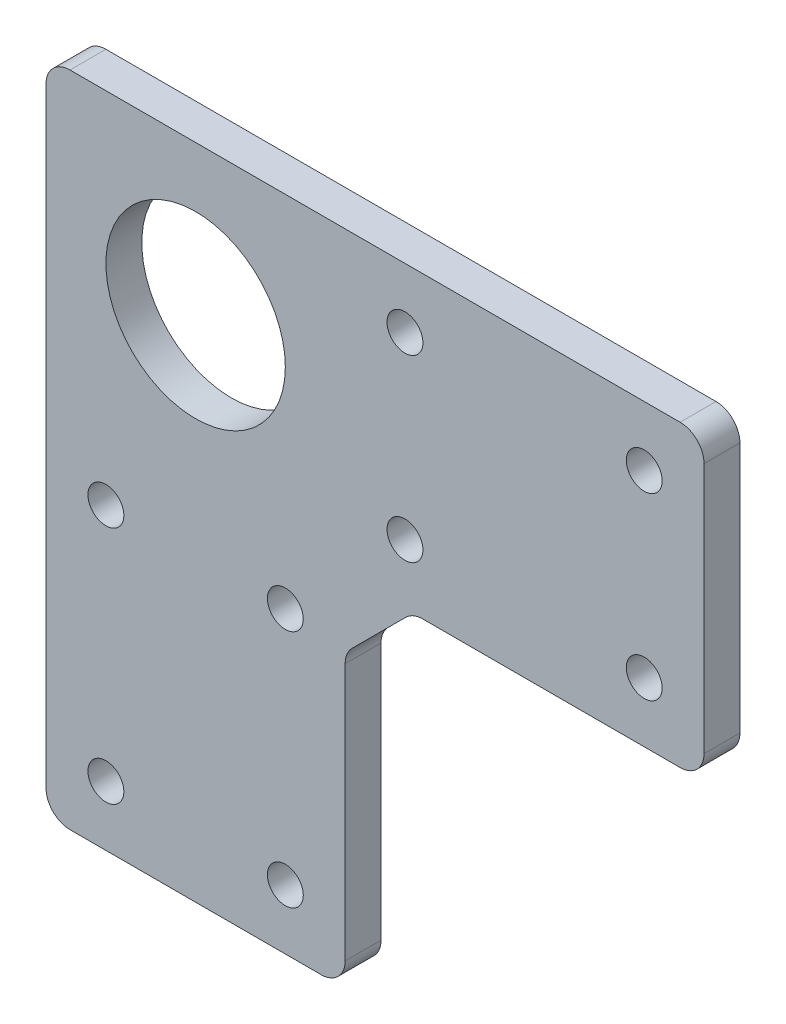
ISO-10303-21;
HEADER;
FILE_DESCRIPTION(('STEP AP214'),'2;1');
FILE_NAME('part.step','',(''),(''),'','','');
FILE_SCHEMA(('AUTOMOTIVE_DESIGN { 1 0 10303 214 1 1 1 1 }'));
ENDSEC;
DATA;
#1=APPLICATION_CONTEXT('core data for automotive mechanical design processes');
#2=APPLICATION_PROTOCOL_DEFINITION('international standard','automotive_design',2000,#1);
#3=PRODUCT_CONTEXT('',#1,'mechanical');
#4=PRODUCT('Part','Part','',(#3));
#5=PRODUCT_RELATED_PRODUCT_CATEGORY('part','',(#4));
#6=PRODUCT_DEFINITION_FORMATION('','',#4);
#7=PRODUCT_DEFINITION_CONTEXT('part definition',#1,'design');
#8=PRODUCT_DEFINITION('design','',#6,#7);
#9=PRODUCT_DEFINITION_SHAPE('','',#8);
#10=(LENGTH_UNIT() NAMED_UNIT(*) SI_UNIT(.MILLI.,.METRE.));
#11=(NAMED_UNIT(*) PLANE_ANGLE_UNIT() SI_UNIT($,.RADIAN.));
#12=(NAMED_UNIT(*) SI_UNIT($,.STERADIAN.) SOLID_ANGLE_UNIT());
#13=UNCERTAINTY_MEASURE_WITH_UNIT(LENGTH_MEASURE(1.E-05),#10,'distance_accuracy_value','');
#14=(GEOMETRIC_REPRESENTATION_CONTEXT(3) GLOBAL_UNCERTAINTY_ASSIGNED_CONTEXT((#13)) GLOBAL_UNIT_ASSIGNED_CONTEXT((#10,
#11,#12)) REPRESENTATION_CONTEXT('',''));
#15=CARTESIAN_POINT('',(0.,0.,0.));
#16=DIRECTION('',(0.,0.,1.));
#17=DIRECTION('',(1.,0.,0.));
#18=AXIS2_PLACEMENT_3D('',#15,#16,#17);
#19=CARTESIAN_POINT('',(25.,0.,1.5));
#20=DIRECTION('',(1.,0.,0.));
#21=DIRECTION('',(0.,1.,0.));
#22=AXIS2_PLACEMENT_3D('',#19,#20,#21);
#23=PLANE('',#22);
#24=DIRECTION('',(0.,-1.,0.));
#25=VECTOR('',#24,1.);
#26=CARTESIAN_POINT('',(25.,0.,1.5));
#27=LINE('',#26,#25);
#28=CARTESIAN_POINT('',(25.,-6.48528137423857,1.5));
#29=VERTEX_POINT('',#28);
#30=CARTESIAN_POINT('',(25.,-28.,1.5));
#31=VERTEX_POINT('',#30);
#32=EDGE_CURVE('E155',#29,#31,#27,.T.);
#33=ORIENTED_EDGE('',*,*,#32,.T.);
#34=DIRECTION('',(0.,0.,-1.));
#35=VECTOR('',#34,1.);
#36=CARTESIAN_POINT('',(25.,-28.,-1.5));
#37=LINE('',#36,#35);
#38=CARTESIAN_POINT('',(25.,-28.,-1.5));
#39=VERTEX_POINT('',#38);
#40=EDGE_CURVE('E159',#31,#39,#37,.T.);
#41=ORIENTED_EDGE('',*,*,#40,.T.);
#42=DIRECTION('',(0.,-1.,0.));
#43=VECTOR('',#42,1.);
#44=CARTESIAN_POINT('',(25.,0.,-1.5));
#45=LINE('',#44,#43);
#46=CARTESIAN_POINT('',(25.,-6.48528137423857,-1.5));
#47=VERTEX_POINT('',#46);
#48=EDGE_CURVE('E158',#47,#39,#45,.T.);
#49=ORIENTED_EDGE('',*,*,#48,.F.);
#50=DIRECTION('',(0.,0.,1.));
#51=VECTOR('',#50,1.);
#52=CARTESIAN_POINT('',(25.,-6.48528137423857,1.5));
#53=LINE('',#52,#51);
#54=EDGE_CURVE('E144',#47,#29,#53,.T.);
#55=ORIENTED_EDGE('',*,*,#54,.T.);
#56=EDGE_LOOP('',(#33,#41,#49,#55));
#57=FACE_BOUND('',#56,.T.);
#58=ADVANCED_FACE('F37',(#57),#23,.T.);
#59=CARTESIAN_POINT('',(0.,0.,1.5));
#60=DIRECTION('',(0.,1.,0.));
#61=DIRECTION('',(0.,0.,1.));
#62=AXIS2_PLACEMENT_3D('',#59,#60,#61);
#63=PLANE('',#62);
#64=DIRECTION('',(1.,0.,0.));
#65=VECTOR('',#64,1.);
#66=CARTESIAN_POINT('',(0.,0.,-1.5));
#67=LINE('',#66,#65);
#68=CARTESIAN_POINT('',(31.4852813742386,0.,-1.5));
#69=VERTEX_POINT('',#68);
#70=CARTESIAN_POINT('',(53.,0.,-1.5));
#71=VERTEX_POINT('',#70);
#72=EDGE_CURVE('E189',#69,#71,#67,.T.);
#73=ORIENTED_EDGE('',*,*,#72,.T.);
#74=DIRECTION('',(0.,0.,-1.));
#75=VECTOR('',#74,1.);
#76=CARTESIAN_POINT('',(53.,0.,1.5));
#77=LINE('',#76,#75);
#78=CARTESIAN_POINT('',(53.,0.,1.5));
#79=VERTEX_POINT('',#78);
#80=EDGE_CURVE('E271',#71,#79,#77,.F.);
#81=ORIENTED_EDGE('',*,*,#80,.T.);
#82=DIRECTION('',(1.,0.,0.));
#83=VECTOR('',#82,1.);
#84=CARTESIAN_POINT('',(0.,0.,1.5));
#85=LINE('',#84,#83);
#86=CARTESIAN_POINT('',(31.4852813742386,0.,1.5));
#87=VERTEX_POINT('',#86);
#88=EDGE_CURVE('E167',#87,#79,#85,.T.);
#89=ORIENTED_EDGE('',*,*,#88,.F.);
#90=DIRECTION('',(0.,0.,1.));
#91=VECTOR('',#90,1.);
#92=CARTESIAN_POINT('',(31.4852813742386,0.,1.5));
#93=LINE('',#92,#91);
#94=EDGE_CURVE('E269',#87,#69,#93,.F.);
#95=ORIENTED_EDGE('',*,*,#94,.T.);
#96=EDGE_LOOP('',(#73,#81,#89,#95));
#97=FACE_BOUND('',#96,.T.);
#98=ADVANCED_FACE('F285',(#97),#63,.F.);
#99=CARTESIAN_POINT('',(55.,0.,1.5));
#100=DIRECTION('',(-1.,0.,0.));
#101=DIRECTION('',(0.,-1.,0.));
#102=AXIS2_PLACEMENT_3D('',#99,#100,#101);
#103=PLANE('',#102);
#104=DIRECTION('',(0.,1.,0.));
#105=VECTOR('',#104,1.);
#106=CARTESIAN_POINT('',(55.,0.,-1.5));
#107=LINE('',#106,#105);
#108=CARTESIAN_POINT('',(55.,2.,-1.5));
#109=VERTEX_POINT('',#108);
#110=CARTESIAN_POINT('',(55.,23.,-1.5));
#111=VERTEX_POINT('',#110);
#112=EDGE_CURVE('E192',#109,#111,#107,.T.);
#113=ORIENTED_EDGE('',*,*,#112,.T.);
#114=DIRECTION('',(0.,0.,-1.));
#115=VECTOR('',#114,1.);
#116=CARTESIAN_POINT('',(55.,23.,1.5));
#117=LINE('',#116,#115);
#118=CARTESIAN_POINT('',(55.,23.,1.5));
#119=VERTEX_POINT('',#118);
#120=EDGE_CURVE('E267',#111,#119,#117,.F.);
#121=ORIENTED_EDGE('',*,*,#120,.T.);
#122=DIRECTION('',(0.,1.,0.));
#123=VECTOR('',#122,1.);
#124=CARTESIAN_POINT('',(55.,0.,1.5));
#125=LINE('',#124,#123);
#126=CARTESIAN_POINT('',(55.,2.,1.5));
#127=VERTEX_POINT('',#126);
#128=EDGE_CURVE('E171',#127,#119,#125,.T.);
#129=ORIENTED_EDGE('',*,*,#128,.F.);
#130=DIRECTION('',(0.,0.,-1.));
#131=VECTOR('',#130,1.);
#132=CARTESIAN_POINT('',(55.,2.,1.5));
#133=LINE('',#132,#131);
#134=EDGE_CURVE('E264',#127,#109,#133,.T.);
#135=ORIENTED_EDGE('',*,*,#134,.T.);
#136=EDGE_LOOP('',(#113,#121,#129,#135));
#137=FACE_BOUND('',#136,.T.);
#138=ADVANCED_FACE('F353',(#137),#103,.F.);
#139=CARTESIAN_POINT('',(0.,25.,1.5));
#140=DIRECTION('',(0.,1.,0.));
#141=DIRECTION('',(0.,0.,1.));
#142=AXIS2_PLACEMENT_3D('',#139,#140,#141);
#143=PLANE('',#142);
#144=DIRECTION('',(1.,0.,0.));
#145=VECTOR('',#144,1.);
#146=CARTESIAN_POINT('',(0.,25.,-1.5));
#147=LINE('',#146,#145);
#148=CARTESIAN_POINT('',(2.,25.,-1.5));
#149=VERTEX_POINT('',#148);
#150=CARTESIAN_POINT('',(53.,25.,-1.5));
#151=VERTEX_POINT('',#150);
#152=EDGE_CURVE('E195',#149,#151,#147,.T.);
#153=ORIENTED_EDGE('',*,*,#152,.F.);
#154=DIRECTION('',(0.,0.,-1.));
#155=VECTOR('',#154,1.);
#156=CARTESIAN_POINT('',(2.,25.,1.5));
#157=LINE('',#156,#155);
#158=CARTESIAN_POINT('',(2.,25.,1.5));
#159=VERTEX_POINT('',#158);
#160=EDGE_CURVE('E262',#149,#159,#157,.F.);
#161=ORIENTED_EDGE('',*,*,#160,.T.);
#162=DIRECTION('',(1.,0.,0.));
#163=VECTOR('',#162,1.);
#164=CARTESIAN_POINT('',(0.,25.,1.5));
#165=LINE('',#164,#163);
#166=CARTESIAN_POINT('',(53.,25.,1.5));
#167=VERTEX_POINT('',#166);
#168=EDGE_CURVE('E182',#159,#167,#165,.T.);
#169=ORIENTED_EDGE('',*,*,#168,.T.);
#170=DIRECTION('',(0.,0.,-1.));
#171=VECTOR('',#170,1.);
#172=CARTESIAN_POINT('',(53.,25.,-1.5));
#173=LINE('',#172,#171);
#174=EDGE_CURVE('E259',#167,#151,#173,.T.);
#175=ORIENTED_EDGE('',*,*,#174,.T.);
#176=EDGE_LOOP('',(#153,#161,#169,#175));
#177=FACE_BOUND('',#176,.T.);
#178=ADVANCED_FACE('F561',(#177),#143,.T.);
#179=CARTESIAN_POINT('',(0.,0.,1.5));
#180=DIRECTION('',(1.,0.,0.));
#181=DIRECTION('',(0.,1.,0.));
#182=AXIS2_PLACEMENT_3D('',#179,#180,#181);
#183=PLANE('',#182);
#184=DIRECTION('',(0.,-1.,0.));
#185=VECTOR('',#184,1.);
#186=CARTESIAN_POINT('',(0.,0.,-1.5));
#187=LINE('',#186,#185);
#188=CARTESIAN_POINT('',(0.,23.,-1.5));
#189=VERTEX_POINT('',#188);
#190=CARTESIAN_POINT('',(0.,-28.,-1.5));
#191=VERTEX_POINT('',#190);
#192=EDGE_CURVE('E174',#189,#191,#187,.T.);
#193=ORIENTED_EDGE('',*,*,#192,.T.);
#194=DIRECTION('',(0.,0.,-1.));
#195=VECTOR('',#194,1.);
#196=CARTESIAN_POINT('',(0.,-28.,1.5));
#197=LINE('',#196,#195);
#198=CARTESIAN_POINT('',(0.,-28.,1.5));
#199=VERTEX_POINT('',#198);
#200=EDGE_CURVE('E53',#191,#199,#197,.F.);
#201=ORIENTED_EDGE('',*,*,#200,.T.);
#202=DIRECTION('',(0.,-1.,0.));
#203=VECTOR('',#202,1.);
#204=CARTESIAN_POINT('',(0.,0.,1.5));
#205=LINE('',#204,#203);
#206=CARTESIAN_POINT('',(0.,23.,1.5));
#207=VERTEX_POINT('',#206);
#208=EDGE_CURVE('E185',#207,#199,#205,.T.);
#209=ORIENTED_EDGE('',*,*,#208,.F.);
#210=DIRECTION('',(0.,0.,-1.));
#211=VECTOR('',#210,1.);
#212=CARTESIAN_POINT('',(0.,23.,-1.5));
#213=LINE('',#212,#211);
#214=EDGE_CURVE('E255',#207,#189,#213,.T.);
#215=ORIENTED_EDGE('',*,*,#214,.T.);
#216=EDGE_LOOP('',(#193,#201,#209,#215));
#217=FACE_BOUND('',#216,.T.);
#218=ADVANCED_FACE('F553',(#217),#183,.F.);
#219=CARTESIAN_POINT('',(0.,-30.,1.5));
#220=DIRECTION('',(0.,1.,0.));
#221=DIRECTION('',(0.,0.,1.));
#222=AXIS2_PLACEMENT_3D('',#219,#220,#221);
#223=PLANE('',#222);
#224=DIRECTION('',(1.,0.,0.));
#225=VECTOR('',#224,1.);
#226=CARTESIAN_POINT('',(0.,-30.,-1.5));
#227=LINE('',#226,#225);
#228=CARTESIAN_POINT('',(2.,-30.,-1.5));
#229=VERTEX_POINT('',#228);
#230=CARTESIAN_POINT('',(23.,-30.,-1.5));
#231=VERTEX_POINT('',#230);
#232=EDGE_CURVE('E168',#229,#231,#227,.T.);
#233=ORIENTED_EDGE('',*,*,#232,.T.);
#234=DIRECTION('',(0.,0.,-1.));
#235=VECTOR('',#234,1.);
#236=CARTESIAN_POINT('',(23.,-30.,1.5));
#237=LINE('',#236,#235);
#238=CARTESIAN_POINT('',(23.,-30.,1.5));
#239=VERTEX_POINT('',#238);
#240=EDGE_CURVE('E245',#231,#239,#237,.F.);
#241=ORIENTED_EDGE('',*,*,#240,.T.);
#242=DIRECTION('',(1.,0.,0.));
#243=VECTOR('',#242,1.);
#244=CARTESIAN_POINT('',(0.,-30.,1.5));
#245=LINE('',#244,#243);
#246=CARTESIAN_POINT('',(2.,-30.,1.5));
#247=VERTEX_POINT('',#246);
#248=EDGE_CURVE('E160',#247,#239,#245,.T.);
#249=ORIENTED_EDGE('',*,*,#248,.F.);
#250=DIRECTION('',(0.,0.,-1.));
#251=VECTOR('',#250,1.);
#252=CARTESIAN_POINT('',(2.,-30.,1.5));
#253=LINE('',#252,#251);
#254=EDGE_CURVE('E242',#247,#229,#253,.T.);
#255=ORIENTED_EDGE('',*,*,#254,.T.);
#256=EDGE_LOOP('',(#233,#241,#249,#255));
#257=FACE_BOUND('',#256,.T.);
#258=ADVANCED_FACE('F319',(#257),#223,.F.);
#259=CARTESIAN_POINT('',(0.,0.,1.5));
#260=DIRECTION('',(0.,0.,1.));
#261=DIRECTION('',(1.,0.,0.));
#262=AXIS2_PLACEMENT_3D('',#259,#260,#261);
#263=PLANE('',#262);
#264=CARTESIAN_POINT('',(12.5,12.5,1.5));
#265=DIRECTION('',(0.,0.,1.));
#266=DIRECTION('',(1.,0.,0.));
#267=AXIS2_PLACEMENT_3D('',#264,#265,#266);
#268=CIRCLE('',#267,7.5);
#269=CARTESIAN_POINT('',(20.,12.5,1.5));
#270=VERTEX_POINT('',#269);
#271=EDGE_CURVE('E623',#270,#270,#268,.T.);
#272=ORIENTED_EDGE('',*,*,#271,.F.);
#273=EDGE_LOOP('',(#272));
#274=FACE_BOUND('',#273,.T.);
#275=ORIENTED_EDGE('',*,*,#248,.T.);
#276=CARTESIAN_POINT('',(23.,-28.,1.5));
#277=DIRECTION('',(0.,0.,1.));
#278=DIRECTION('',(1.,0.,0.));
#279=AXIS2_PLACEMENT_3D('',#276,#277,#278);
#280=CIRCLE('',#279,2.);
#281=EDGE_CURVE('E166',#239,#31,#280,.T.);
#282=ORIENTED_EDGE('',*,*,#281,.T.);
#283=ORIENTED_EDGE('',*,*,#32,.F.);
#284=CARTESIAN_POINT('',(27.,-6.48528137423857,1.5));
#285=DIRECTION('',(0.,0.,1.));
#286=DIRECTION('',(1.,0.,0.));
#287=AXIS2_PLACEMENT_3D('',#284,#285,#286);
#288=CIRCLE('',#287,2.);
#289=CARTESIAN_POINT('',(25.5857864376269,-5.07106781186548,1.5));
#290=VERTEX_POINT('',#289);
#291=EDGE_CURVE('E140',#29,#290,#288,.F.);
#292=ORIENTED_EDGE('',*,*,#291,.T.);
#293=DIRECTION('',(0.707106781186547,0.707106781186548,0.));
#294=VECTOR('',#293,1.);
#295=CARTESIAN_POINT('',(25.,-5.65685424949238,1.5));
#296=LINE('',#295,#294);
#297=CARTESIAN_POINT('',(30.0710678118655,-0.585786437626901,1.5));
#298=VERTEX_POINT('',#297);
#299=EDGE_CURVE('E280',#290,#298,#296,.T.);
#300=ORIENTED_EDGE('',*,*,#299,.T.);
#301=CARTESIAN_POINT('',(31.4852813742386,-2.,1.5));
#302=DIRECTION('',(0.,0.,1.));
#303=DIRECTION('',(1.,0.,0.));
#304=AXIS2_PLACEMENT_3D('',#301,#302,#303);
#305=CIRCLE('',#304,2.);
#306=EDGE_CURVE('E46',#298,#87,#305,.F.);
#307=ORIENTED_EDGE('',*,*,#306,.T.);
#308=ORIENTED_EDGE('',*,*,#88,.T.);
#309=CARTESIAN_POINT('',(53.,2.,1.5));
#310=DIRECTION('',(0.,0.,1.));
#311=DIRECTION('',(1.,0.,0.));
#312=AXIS2_PLACEMENT_3D('',#309,#310,#311);
#313=CIRCLE('',#312,2.);
#314=EDGE_CURVE('E247',#79,#127,#313,.T.);
#315=ORIENTED_EDGE('',*,*,#314,.T.);
#316=ORIENTED_EDGE('',*,*,#128,.T.);
#317=CARTESIAN_POINT('',(53.,23.,1.5));
#318=DIRECTION('',(0.,0.,1.));
#319=DIRECTION('',(1.,0.,0.));
#320=AXIS2_PLACEMENT_3D('',#317,#318,#319);
#321=CIRCLE('',#320,2.);
#322=EDGE_CURVE('E249',#119,#167,#321,.T.);
#323=ORIENTED_EDGE('',*,*,#322,.T.);
#324=ORIENTED_EDGE('',*,*,#168,.F.);
#325=CARTESIAN_POINT('',(2.,23.,1.5));
#326=DIRECTION('',(0.,0.,1.));
#327=DIRECTION('',(1.,0.,0.));
#328=AXIS2_PLACEMENT_3D('',#325,#326,#327);
#329=CIRCLE('',#328,2.);
#330=EDGE_CURVE('E60',#159,#207,#329,.T.);
#331=ORIENTED_EDGE('',*,*,#330,.T.);
#332=ORIENTED_EDGE('',*,*,#208,.T.);
#333=CARTESIAN_POINT('',(2.,-28.,1.5));
#334=DIRECTION('',(0.,0.,1.));
#335=DIRECTION('',(1.,0.,0.));
#336=AXIS2_PLACEMENT_3D('',#333,#334,#335);
#337=CIRCLE('',#336,2.);
#338=EDGE_CURVE('E252',#199,#247,#337,.T.);
#339=ORIENTED_EDGE('',*,*,#338,.T.);
#340=EDGE_LOOP('',(#275,#282,#283,#292,#300,#307,#308,#315,#316,#323,#324,#331,#332,#339));
#341=FACE_BOUND('',#340,.T.);
#342=CARTESIAN_POINT('',(5.,-25.,1.5));
#343=DIRECTION('',(0.,0.,1.));
#344=DIRECTION('',(1.,0.,0.));
#345=AXIS2_PLACEMENT_3D('',#342,#343,#344);
#346=CIRCLE('',#345,1.5);
#347=CARTESIAN_POINT('',(6.5,-25.,1.5));
#348=VERTEX_POINT('',#347);
#349=EDGE_CURVE('E177',#348,#348,#346,.T.);
#350=ORIENTED_EDGE('',*,*,#349,.F.);
#351=EDGE_LOOP('',(#350));
#352=FACE_BOUND('',#351,.T.);
#353=CARTESIAN_POINT('',(5.,-4.99999999999998,1.5));
#354=DIRECTION('',(0.,0.,1.));
#355=DIRECTION('',(1.,0.,0.));
#356=AXIS2_PLACEMENT_3D('',#353,#354,#355);
#357=CIRCLE('',#356,1.5);
#358=CARTESIAN_POINT('',(6.5,-4.99999999999998,1.5));
#359=VERTEX_POINT('',#358);
#360=EDGE_CURVE('E227',#359,#359,#357,.T.);
#361=ORIENTED_EDGE('',*,*,#360,.F.);
#362=EDGE_LOOP('',(#361));
#363=FACE_BOUND('',#362,.T.);
#364=CARTESIAN_POINT('',(20.,-4.99999999999999,1.5));
#365=DIRECTION('',(0.,0.,1.));
#366=DIRECTION('',(1.,0.,0.));
#367=AXIS2_PLACEMENT_3D('',#364,#365,#366);
#368=CIRCLE('',#367,1.5);
#369=CARTESIAN_POINT('',(21.5,-4.99999999999999,1.5));
#370=VERTEX_POINT('',#369);
#371=EDGE_CURVE('E223',#370,#370,#368,.T.);
#372=ORIENTED_EDGE('',*,*,#371,.F.);
#373=EDGE_LOOP('',(#372));
#374=FACE_BOUND('',#373,.T.);
#375=CARTESIAN_POINT('',(30.,5.,1.5));
#376=DIRECTION('',(0.,0.,1.));
#377=DIRECTION('',(1.,0.,0.));
#378=AXIS2_PLACEMENT_3D('',#375,#376,#377);
#379=CIRCLE('',#378,1.50000000000001);
#380=CARTESIAN_POINT('',(31.5,5.,1.5));
#381=VERTEX_POINT('',#380);
#382=EDGE_CURVE('E219',#381,#381,#379,.T.);
#383=ORIENTED_EDGE('',*,*,#382,.F.);
#384=EDGE_LOOP('',(#383));
#385=FACE_BOUND('',#384,.T.);
#386=CARTESIAN_POINT('',(30.,20.,1.5));
#387=DIRECTION('',(0.,0.,1.));
#388=DIRECTION('',(1.,0.,0.));
#389=AXIS2_PLACEMENT_3D('',#386,#387,#388);
#390=CIRCLE('',#389,1.5);
#391=CARTESIAN_POINT('',(31.5,20.,1.5));
#392=VERTEX_POINT('',#391);
#393=EDGE_CURVE('E215',#392,#392,#390,.T.);
#394=ORIENTED_EDGE('',*,*,#393,.F.);
#395=EDGE_LOOP('',(#394));
#396=FACE_BOUND('',#395,.T.);
#397=CARTESIAN_POINT('',(50.,20.,1.5));
#398=DIRECTION('',(0.,0.,1.));
#399=DIRECTION('',(1.,0.,0.));
#400=AXIS2_PLACEMENT_3D('',#397,#398,#399);
#401=CIRCLE('',#400,1.5);
#402=CARTESIAN_POINT('',(51.5,20.,1.5));
#403=VERTEX_POINT('',#402);
#404=EDGE_CURVE('E211',#403,#403,#401,.T.);
#405=ORIENTED_EDGE('',*,*,#404,.F.);
#406=EDGE_LOOP('',(#405));
#407=FACE_BOUND('',#406,.T.);
#408=CARTESIAN_POINT('',(50.,5.00000000000002,1.5));
#409=DIRECTION('',(0.,0.,1.));
#410=DIRECTION('',(1.,0.,0.));
#411=AXIS2_PLACEMENT_3D('',#408,#409,#410);
#412=CIRCLE('',#411,1.5);
#413=CARTESIAN_POINT('',(51.5,5.00000000000002,1.5));
#414=VERTEX_POINT('',#413);
#415=EDGE_CURVE('E207',#414,#414,#412,.T.);
#416=ORIENTED_EDGE('',*,*,#415,.F.);
#417=EDGE_LOOP('',(#416));
#418=FACE_BOUND('',#417,.T.);
#419=CARTESIAN_POINT('',(20.,-25.,1.5));
#420=DIRECTION('',(0.,0.,1.));
#421=DIRECTION('',(1.,0.,0.));
#422=AXIS2_PLACEMENT_3D('',#419,#420,#421);
#423=CIRCLE('',#422,1.5);
#424=CARTESIAN_POINT('',(21.5,-25.,1.5));
#425=VERTEX_POINT('',#424);
#426=EDGE_CURVE('E202',#425,#425,#423,.T.);
#427=ORIENTED_EDGE('',*,*,#426,.F.);
#428=EDGE_LOOP('',(#427));
#429=FACE_BOUND('',#428,.T.);
#430=ADVANCED_FACE('F163',(#274,#341,#352,#363,#374,#385,#396,#407,#418,#429),#263,.T.);
#431=CARTESIAN_POINT('',(0.,0.,-1.5));
#432=DIRECTION('',(0.,0.,1.));
#433=DIRECTION('',(1.,0.,0.));
#434=AXIS2_PLACEMENT_3D('',#431,#432,#433);
#435=PLANE('',#434);
#436=CARTESIAN_POINT('',(12.5,12.5,-1.5));
#437=DIRECTION('',(0.,0.,1.));
#438=DIRECTION('',(1.,0.,0.));
#439=AXIS2_PLACEMENT_3D('',#436,#437,#438);
#440=CIRCLE('',#439,7.5);
#441=CARTESIAN_POINT('',(20.,12.5,-1.5));
#442=VERTEX_POINT('',#441);
#443=EDGE_CURVE('E41',#442,#442,#440,.T.);
#444=ORIENTED_EDGE('',*,*,#443,.T.);
#445=EDGE_LOOP('',(#444));
#446=FACE_BOUND('',#445,.T.);
#447=ORIENTED_EDGE('',*,*,#48,.T.);
#448=CARTESIAN_POINT('',(23.,-28.,-1.5));
#449=DIRECTION('',(0.,0.,1.));
#450=DIRECTION('',(1.,0.,0.));
#451=AXIS2_PLACEMENT_3D('',#448,#449,#450);
#452=CIRCLE('',#451,2.);
#453=EDGE_CURVE('E240',#39,#231,#452,.F.);
#454=ORIENTED_EDGE('',*,*,#453,.T.);
#455=ORIENTED_EDGE('',*,*,#232,.F.);
#456=CARTESIAN_POINT('',(2.,-28.,-1.5));
#457=DIRECTION('',(0.,0.,1.));
#458=DIRECTION('',(1.,0.,0.));
#459=AXIS2_PLACEMENT_3D('',#456,#457,#458);
#460=CIRCLE('',#459,2.);
#461=EDGE_CURVE('E238',#229,#191,#460,.F.);
#462=ORIENTED_EDGE('',*,*,#461,.T.);
#463=ORIENTED_EDGE('',*,*,#192,.F.);
#464=CARTESIAN_POINT('',(2.,23.,-1.5));
#465=DIRECTION('',(0.,0.,1.));
#466=DIRECTION('',(1.,0.,0.));
#467=AXIS2_PLACEMENT_3D('',#464,#465,#466);
#468=CIRCLE('',#467,2.);
#469=EDGE_CURVE('E236',#189,#149,#468,.F.);
#470=ORIENTED_EDGE('',*,*,#469,.T.);
#471=ORIENTED_EDGE('',*,*,#152,.T.);
#472=CARTESIAN_POINT('',(53.,23.,-1.5));
#473=DIRECTION('',(0.,0.,1.));
#474=DIRECTION('',(1.,0.,0.));
#475=AXIS2_PLACEMENT_3D('',#472,#473,#474);
#476=CIRCLE('',#475,2.);
#477=EDGE_CURVE('E234',#151,#111,#476,.F.);
#478=ORIENTED_EDGE('',*,*,#477,.T.);
#479=ORIENTED_EDGE('',*,*,#112,.F.);
#480=CARTESIAN_POINT('',(53.,2.,-1.5));
#481=DIRECTION('',(0.,0.,1.));
#482=DIRECTION('',(1.,0.,0.));
#483=AXIS2_PLACEMENT_3D('',#480,#481,#482);
#484=CIRCLE('',#483,2.);
#485=EDGE_CURVE('E232',#109,#71,#484,.F.);
#486=ORIENTED_EDGE('',*,*,#485,.T.);
#487=ORIENTED_EDGE('',*,*,#72,.F.);
#488=CARTESIAN_POINT('',(31.4852813742386,-2.,-1.5));
#489=DIRECTION('',(0.,0.,1.));
#490=DIRECTION('',(1.,0.,0.));
#491=AXIS2_PLACEMENT_3D('',#488,#489,#490);
#492=CIRCLE('',#491,2.);
#493=CARTESIAN_POINT('',(30.0710678118655,-0.585786437626903,-1.5));
#494=VERTEX_POINT('',#493);
#495=EDGE_CURVE('E11',#69,#494,#492,.T.);
#496=ORIENTED_EDGE('',*,*,#495,.T.);
#497=DIRECTION('',(-0.707106781186547,-0.707106781186548,0.));
#498=VECTOR('',#497,1.);
#499=CARTESIAN_POINT('',(25.,-5.65685424949238,-1.5));
#500=LINE('',#499,#498);
#501=CARTESIAN_POINT('',(25.5857864376269,-5.07106781186548,-1.5));
#502=VERTEX_POINT('',#501);
#503=EDGE_CURVE('E203',#494,#502,#500,.T.);
#504=ORIENTED_EDGE('',*,*,#503,.T.);
#505=CARTESIAN_POINT('',(27.,-6.48528137423857,-1.5));
#506=DIRECTION('',(0.,0.,1.));
#507=DIRECTION('',(1.,0.,0.));
#508=AXIS2_PLACEMENT_3D('',#505,#506,#507);
#509=CIRCLE('',#508,2.);
#510=EDGE_CURVE('E149',#502,#47,#509,.T.);
#511=ORIENTED_EDGE('',*,*,#510,.T.);
#512=EDGE_LOOP('',(#447,#454,#455,#462,#463,#470,#471,#478,#479,#486,#487,#496,#504,#511));
#513=FACE_BOUND('',#512,.T.);
#514=CARTESIAN_POINT('',(5.,-25.,-1.5));
#515=DIRECTION('',(0.,0.,1.));
#516=DIRECTION('',(1.,0.,0.));
#517=AXIS2_PLACEMENT_3D('',#514,#515,#516);
#518=CIRCLE('',#517,1.5);
#519=CARTESIAN_POINT('',(6.5,-25.,-1.5));
#520=VERTEX_POINT('',#519);
#521=EDGE_CURVE('E228',#520,#520,#518,.T.);
#522=ORIENTED_EDGE('',*,*,#521,.T.);
#523=EDGE_LOOP('',(#522));
#524=FACE_BOUND('',#523,.T.);
#525=CARTESIAN_POINT('',(5.,-4.99999999999998,-1.5));
#526=DIRECTION('',(0.,0.,1.));
#527=DIRECTION('',(1.,0.,0.));
#528=AXIS2_PLACEMENT_3D('',#525,#526,#527);
#529=CIRCLE('',#528,1.5);
#530=CARTESIAN_POINT('',(6.5,-4.99999999999998,-1.5));
#531=VERTEX_POINT('',#530);
#532=EDGE_CURVE('E224',#531,#531,#529,.T.);
#533=ORIENTED_EDGE('',*,*,#532,.T.);
#534=EDGE_LOOP('',(#533));
#535=FACE_BOUND('',#534,.T.);
#536=CARTESIAN_POINT('',(20.,-4.99999999999999,-1.5));
#537=DIRECTION('',(0.,0.,1.));
#538=DIRECTION('',(1.,0.,0.));
#539=AXIS2_PLACEMENT_3D('',#536,#537,#538);
#540=CIRCLE('',#539,1.5);
#541=CARTESIAN_POINT('',(21.5,-4.99999999999999,-1.5));
#542=VERTEX_POINT('',#541);
#543=EDGE_CURVE('E220',#542,#542,#540,.T.);
#544=ORIENTED_EDGE('',*,*,#543,.T.);
#545=EDGE_LOOP('',(#544));
#546=FACE_BOUND('',#545,.T.);
#547=CARTESIAN_POINT('',(30.,5.,-1.5));
#548=DIRECTION('',(0.,0.,1.));
#549=DIRECTION('',(1.,0.,0.));
#550=AXIS2_PLACEMENT_3D('',#547,#548,#549);
#551=CIRCLE('',#550,1.50000000000001);
#552=CARTESIAN_POINT('',(31.5,5.,-1.5));
#553=VERTEX_POINT('',#552);
#554=EDGE_CURVE('E216',#553,#553,#551,.T.);
#555=ORIENTED_EDGE('',*,*,#554,.T.);
#556=EDGE_LOOP('',(#555));
#557=FACE_BOUND('',#556,.T.);
#558=CARTESIAN_POINT('',(30.,20.,-1.5));
#559=DIRECTION('',(0.,0.,1.));
#560=DIRECTION('',(1.,0.,0.));
#561=AXIS2_PLACEMENT_3D('',#558,#559,#560);
#562=CIRCLE('',#561,1.5);
#563=CARTESIAN_POINT('',(31.5,20.,-1.5));
#564=VERTEX_POINT('',#563);
#565=EDGE_CURVE('E212',#564,#564,#562,.T.);
#566=ORIENTED_EDGE('',*,*,#565,.T.);
#567=EDGE_LOOP('',(#566));
#568=FACE_BOUND('',#567,.T.);
#569=CARTESIAN_POINT('',(50.,20.,-1.5));
#570=DIRECTION('',(0.,0.,1.));
#571=DIRECTION('',(1.,0.,0.));
#572=AXIS2_PLACEMENT_3D('',#569,#570,#571);
#573=CIRCLE('',#572,1.5);
#574=CARTESIAN_POINT('',(51.5,20.,-1.5));
#575=VERTEX_POINT('',#574);
#576=EDGE_CURVE('E208',#575,#575,#573,.T.);
#577=ORIENTED_EDGE('',*,*,#576,.T.);
#578=EDGE_LOOP('',(#577));
#579=FACE_BOUND('',#578,.T.);
#580=CARTESIAN_POINT('',(50.,5.00000000000002,-1.5));
#581=DIRECTION('',(0.,0.,1.));
#582=DIRECTION('',(1.,0.,0.));
#583=AXIS2_PLACEMENT_3D('',#580,#581,#582);
#584=CIRCLE('',#583,1.5);
#585=CARTESIAN_POINT('',(51.5,5.00000000000002,-1.5));
#586=VERTEX_POINT('',#585);
#587=EDGE_CURVE('E204',#586,#586,#584,.T.);
#588=ORIENTED_EDGE('',*,*,#587,.T.);
#589=EDGE_LOOP('',(#588));
#590=FACE_BOUND('',#589,.T.);
#591=CARTESIAN_POINT('',(20.,-25.,-1.5));
#592=DIRECTION('',(0.,0.,1.));
#593=DIRECTION('',(1.,0.,0.));
#594=AXIS2_PLACEMENT_3D('',#591,#592,#593);
#595=CIRCLE('',#594,1.5);
#596=CARTESIAN_POINT('',(21.5,-25.,-1.5));
#597=VERTEX_POINT('',#596);
#598=EDGE_CURVE('E199',#597,#597,#595,.T.);
#599=ORIENTED_EDGE('',*,*,#598,.T.);
#600=EDGE_LOOP('',(#599));
#601=FACE_BOUND('',#600,.T.);
#602=ADVANCED_FACE('F292',(#446,#513,#524,#535,#546,#557,#568,#579,#590,#601),#435,.F.);
#603=CARTESIAN_POINT('',(20.,-25.,-20.));
#604=DIRECTION('',(0.,0.,1.));
#605=DIRECTION('',(1.,0.,0.));
#606=AXIS2_PLACEMENT_3D('',#603,#604,#605);
#607=CYLINDRICAL_SURFACE('',#606,1.5);
#608=ORIENTED_EDGE('',*,*,#426,.T.);
#609=EDGE_LOOP('',(#608));
#610=FACE_BOUND('',#609,.T.);
#611=ORIENTED_EDGE('',*,*,#598,.F.);
#612=EDGE_LOOP('',(#611));
#613=FACE_BOUND('',#612,.T.);
#614=ADVANCED_FACE('F334',(#610,#613),#607,.F.);
#615=CARTESIAN_POINT('',(50.,5.00000000000002,-20.));
#616=DIRECTION('',(0.,0.,1.));
#617=DIRECTION('',(1.,0.,0.));
#618=AXIS2_PLACEMENT_3D('',#615,#616,#617);
#619=CYLINDRICAL_SURFACE('',#618,1.5);
#620=ORIENTED_EDGE('',*,*,#415,.T.);
#621=EDGE_LOOP('',(#620));
#622=FACE_BOUND('',#621,.T.);
#623=ORIENTED_EDGE('',*,*,#587,.F.);
#624=EDGE_LOOP('',(#623));
#625=FACE_BOUND('',#624,.T.);
#626=ADVANCED_FACE('F337',(#622,#625),#619,.F.);
#627=CARTESIAN_POINT('',(50.,20.,-20.));
#628=DIRECTION('',(0.,0.,1.));
#629=DIRECTION('',(1.,0.,0.));
#630=AXIS2_PLACEMENT_3D('',#627,#628,#629);
#631=CYLINDRICAL_SURFACE('',#630,1.5);
#632=ORIENTED_EDGE('',*,*,#404,.T.);
#633=EDGE_LOOP('',(#632));
#634=FACE_BOUND('',#633,.T.);
#635=ORIENTED_EDGE('',*,*,#576,.F.);
#636=EDGE_LOOP('',(#635));
#637=FACE_BOUND('',#636,.T.);
#638=ADVANCED_FACE('F398',(#634,#637),#631,.F.);
#639=CARTESIAN_POINT('',(30.,20.,-20.));
#640=DIRECTION('',(0.,0.,1.));
#641=DIRECTION('',(1.,0.,0.));
#642=AXIS2_PLACEMENT_3D('',#639,#640,#641);
#643=CYLINDRICAL_SURFACE('',#642,1.5);
#644=ORIENTED_EDGE('',*,*,#393,.T.);
#645=EDGE_LOOP('',(#644));
#646=FACE_BOUND('',#645,.T.);
#647=ORIENTED_EDGE('',*,*,#565,.F.);
#648=EDGE_LOOP('',(#647));
#649=FACE_BOUND('',#648,.T.);
#650=ADVANCED_FACE('F394',(#646,#649),#643,.F.);
#651=CARTESIAN_POINT('',(30.,5.,-20.));
#652=DIRECTION('',(0.,0.,1.));
#653=DIRECTION('',(1.,0.,0.));
#654=AXIS2_PLACEMENT_3D('',#651,#652,#653);
#655=CYLINDRICAL_SURFACE('',#654,1.50000000000001);
#656=ORIENTED_EDGE('',*,*,#382,.T.);
#657=EDGE_LOOP('',(#656));
#658=FACE_BOUND('',#657,.T.);
#659=ORIENTED_EDGE('',*,*,#554,.F.);
#660=EDGE_LOOP('',(#659));
#661=FACE_BOUND('',#660,.T.);
#662=ADVANCED_FACE('F397',(#658,#661),#655,.F.);
#663=CARTESIAN_POINT('',(20.,-4.99999999999999,-20.));
#664=DIRECTION('',(0.,0.,1.));
#665=DIRECTION('',(1.,0.,0.));
#666=AXIS2_PLACEMENT_3D('',#663,#664,#665);
#667=CYLINDRICAL_SURFACE('',#666,1.5);
#668=ORIENTED_EDGE('',*,*,#371,.T.);
#669=EDGE_LOOP('',(#668));
#670=FACE_BOUND('',#669,.T.);
#671=ORIENTED_EDGE('',*,*,#543,.F.);
#672=EDGE_LOOP('',(#671));
#673=FACE_BOUND('',#672,.T.);
#674=ADVANCED_FACE('F411',(#670,#673),#667,.F.);
#675=CARTESIAN_POINT('',(5.,-4.99999999999998,-20.));
#676=DIRECTION('',(0.,0.,1.));
#677=DIRECTION('',(1.,0.,0.));
#678=AXIS2_PLACEMENT_3D('',#675,#676,#677);
#679=CYLINDRICAL_SURFACE('',#678,1.5);
#680=ORIENTED_EDGE('',*,*,#360,.T.);
#681=EDGE_LOOP('',(#680));
#682=FACE_BOUND('',#681,.T.);
#683=ORIENTED_EDGE('',*,*,#532,.F.);
#684=EDGE_LOOP('',(#683));
#685=FACE_BOUND('',#684,.T.);
#686=ADVANCED_FACE('F314',(#682,#685),#679,.F.);
#687=CARTESIAN_POINT('',(5.,-25.,-20.));
#688=DIRECTION('',(0.,0.,1.));
#689=DIRECTION('',(1.,0.,0.));
#690=AXIS2_PLACEMENT_3D('',#687,#688,#689);
#691=CYLINDRICAL_SURFACE('',#690,1.5);
#692=ORIENTED_EDGE('',*,*,#349,.T.);
#693=EDGE_LOOP('',(#692));
#694=FACE_BOUND('',#693,.T.);
#695=ORIENTED_EDGE('',*,*,#521,.F.);
#696=EDGE_LOOP('',(#695));
#697=FACE_BOUND('',#696,.T.);
#698=ADVANCED_FACE('F393',(#694,#697),#691,.F.);
#699=CARTESIAN_POINT('',(25.,-5.65685424949238,-9.5));
#700=DIRECTION('',(0.707106781186548,-0.707106781186547,0.));
#701=DIRECTION('',(0.707106781186547,0.707106781186548,0.));
#702=AXIS2_PLACEMENT_3D('',#699,#700,#701);
#703=PLANE('',#702);
#704=ORIENTED_EDGE('',*,*,#299,.F.);
#705=DIRECTION('',(0.,0.,1.));
#706=VECTOR('',#705,1.);
#707=CARTESIAN_POINT('',(25.5857864376269,-5.07106781186548,-1.5));
#708=LINE('',#707,#706);
#709=EDGE_CURVE('E145',#290,#502,#708,.F.);
#710=ORIENTED_EDGE('',*,*,#709,.T.);
#711=ORIENTED_EDGE('',*,*,#503,.F.);
#712=DIRECTION('',(0.,0.,1.));
#713=VECTOR('',#712,1.);
#714=CARTESIAN_POINT('',(30.0710678118655,-0.585786437626902,-9.5));
#715=LINE('',#714,#713);
#716=EDGE_CURVE('E273',#494,#298,#715,.T.);
#717=ORIENTED_EDGE('',*,*,#716,.T.);
#718=EDGE_LOOP('',(#704,#710,#711,#717));
#719=FACE_BOUND('',#718,.T.);
#720=ADVANCED_FACE('F295',(#719),#703,.T.);
#721=CARTESIAN_POINT('',(23.,-28.,1.5));
#722=DIRECTION('',(0.,0.,1.));
#723=DIRECTION('',(1.,0.,0.));
#724=AXIS2_PLACEMENT_3D('',#721,#722,#723);
#725=CYLINDRICAL_SURFACE('',#724,2.);
#726=ORIENTED_EDGE('',*,*,#281,.F.);
#727=ORIENTED_EDGE('',*,*,#240,.F.);
#728=ORIENTED_EDGE('',*,*,#453,.F.);
#729=ORIENTED_EDGE('',*,*,#40,.F.);
#730=EDGE_LOOP('',(#726,#727,#728,#729));
#731=FACE_BOUND('',#730,.T.);
#732=ADVANCED_FACE('F357',(#731),#725,.T.);
#733=CARTESIAN_POINT('',(2.,-28.,1.5));
#734=DIRECTION('',(0.,0.,-1.));
#735=DIRECTION('',(-1.,0.,0.));
#736=AXIS2_PLACEMENT_3D('',#733,#734,#735);
#737=CYLINDRICAL_SURFACE('',#736,2.);
#738=ORIENTED_EDGE('',*,*,#338,.F.);
#739=ORIENTED_EDGE('',*,*,#200,.F.);
#740=ORIENTED_EDGE('',*,*,#461,.F.);
#741=ORIENTED_EDGE('',*,*,#254,.F.);
#742=EDGE_LOOP('',(#738,#739,#740,#741));
#743=FACE_BOUND('',#742,.T.);
#744=ADVANCED_FACE('F360',(#743),#737,.T.);
#745=CARTESIAN_POINT('',(2.,23.,1.5));
#746=DIRECTION('',(0.,0.,1.));
#747=DIRECTION('',(1.,0.,0.));
#748=AXIS2_PLACEMENT_3D('',#745,#746,#747);
#749=CYLINDRICAL_SURFACE('',#748,2.);
#750=ORIENTED_EDGE('',*,*,#330,.F.);
#751=ORIENTED_EDGE('',*,*,#160,.F.);
#752=ORIENTED_EDGE('',*,*,#469,.F.);
#753=ORIENTED_EDGE('',*,*,#214,.F.);
#754=EDGE_LOOP('',(#750,#751,#752,#753));
#755=FACE_BOUND('',#754,.T.);
#756=ADVANCED_FACE('F364',(#755),#749,.T.);
#757=CARTESIAN_POINT('',(53.,23.,1.5));
#758=DIRECTION('',(0.,0.,1.));
#759=DIRECTION('',(1.,0.,0.));
#760=AXIS2_PLACEMENT_3D('',#757,#758,#759);
#761=CYLINDRICAL_SURFACE('',#760,2.);
#762=ORIENTED_EDGE('',*,*,#322,.F.);
#763=ORIENTED_EDGE('',*,*,#120,.F.);
#764=ORIENTED_EDGE('',*,*,#477,.F.);
#765=ORIENTED_EDGE('',*,*,#174,.F.);
#766=EDGE_LOOP('',(#762,#763,#764,#765));
#767=FACE_BOUND('',#766,.T.);
#768=ADVANCED_FACE('F368',(#767),#761,.T.);
#769=CARTESIAN_POINT('',(53.,2.,1.5));
#770=DIRECTION('',(0.,0.,-1.));
#771=DIRECTION('',(-1.,0.,0.));
#772=AXIS2_PLACEMENT_3D('',#769,#770,#771);
#773=CYLINDRICAL_SURFACE('',#772,2.);
#774=ORIENTED_EDGE('',*,*,#314,.F.);
#775=ORIENTED_EDGE('',*,*,#80,.F.);
#776=ORIENTED_EDGE('',*,*,#485,.F.);
#777=ORIENTED_EDGE('',*,*,#134,.F.);
#778=EDGE_LOOP('',(#774,#775,#776,#777));
#779=FACE_BOUND('',#778,.T.);
#780=ADVANCED_FACE('F372',(#779),#773,.T.);
#781=CARTESIAN_POINT('',(27.,-6.48528137423857,1.5));
#782=DIRECTION('',(0.,0.,-1.));
#783=DIRECTION('',(-1.,0.,0.));
#784=AXIS2_PLACEMENT_3D('',#781,#782,#783);
#785=CYLINDRICAL_SURFACE('',#784,2.);
#786=ORIENTED_EDGE('',*,*,#510,.F.);
#787=ORIENTED_EDGE('',*,*,#709,.F.);
#788=ORIENTED_EDGE('',*,*,#291,.F.);
#789=ORIENTED_EDGE('',*,*,#54,.F.);
#790=EDGE_LOOP('',(#786,#787,#788,#789));
#791=FACE_BOUND('',#790,.T.);
#792=ADVANCED_FACE('F143',(#791),#785,.F.);
#793=CARTESIAN_POINT('',(31.4852813742386,-2.,-9.5));
#794=DIRECTION('',(0.,0.,1.));
#795=DIRECTION('',(1.,0.,0.));
#796=AXIS2_PLACEMENT_3D('',#793,#794,#795);
#797=CYLINDRICAL_SURFACE('',#796,2.);
#798=ORIENTED_EDGE('',*,*,#495,.F.);
#799=ORIENTED_EDGE('',*,*,#94,.F.);
#800=ORIENTED_EDGE('',*,*,#306,.F.);
#801=ORIENTED_EDGE('',*,*,#716,.F.);
#802=EDGE_LOOP('',(#798,#799,#800,#801));
#803=FACE_BOUND('',#802,.T.);
#804=ADVANCED_FACE('F39',(#803),#797,.F.);
#805=CARTESIAN_POINT('',(12.5,12.5,-8.5));
#806=DIRECTION('',(0.,0.,1.));
#807=DIRECTION('',(1.,0.,0.));
#808=AXIS2_PLACEMENT_3D('',#805,#806,#807);
#809=CYLINDRICAL_SURFACE('',#808,7.5);
#810=ORIENTED_EDGE('',*,*,#271,.T.);
#811=EDGE_LOOP('',(#810));
#812=FACE_BOUND('',#811,.T.);
#813=ORIENTED_EDGE('',*,*,#443,.F.);
#814=EDGE_LOOP('',(#813));
#815=FACE_BOUND('',#814,.T.);
#816=ADVANCED_FACE('F380',(#812,#815),#809,.F.);
#817=CLOSED_SHELL('',(#58,#98,#138,#178,#218,#258,#430,#602,#614,#626,#638,#650,#662,#674,#686,
#698,#720,#732,#744,#756,#768,#780,#792,#804,#816));
#818=MANIFOLD_SOLID_BREP('B2',#817);
#819=ADVANCED_BREP_SHAPE_REPRESENTATION('',(#18,#818),#14);
#820=SHAPE_DEFINITION_REPRESENTATION(#9,#819);
ENDSEC;
END-ISO-10303-21;
